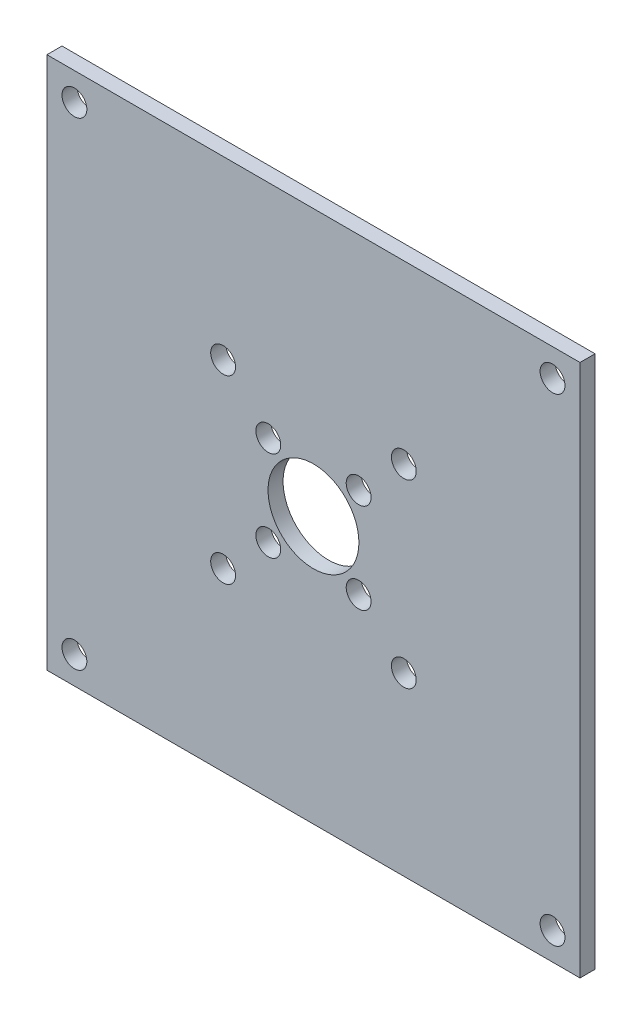
ISO-10303-21;
HEADER;
FILE_DESCRIPTION(('STEP AP214'),'2;1');
FILE_NAME('part.step','',(''),(''),'','','');
FILE_SCHEMA(('AUTOMOTIVE_DESIGN { 1 0 10303 214 1 1 1 1 }'));
ENDSEC;
DATA;
#1=APPLICATION_CONTEXT('core data for automotive mechanical design processes');
#2=APPLICATION_PROTOCOL_DEFINITION('international standard','automotive_design',2000,#1);
#3=PRODUCT_CONTEXT('',#1,'mechanical');
#4=PRODUCT('Part','Part','',(#3));
#5=PRODUCT_RELATED_PRODUCT_CATEGORY('part','',(#4));
#6=PRODUCT_DEFINITION_FORMATION('','',#4);
#7=PRODUCT_DEFINITION_CONTEXT('part definition',#1,'design');
#8=PRODUCT_DEFINITION('design','',#6,#7);
#9=PRODUCT_DEFINITION_SHAPE('','',#8);
#10=(LENGTH_UNIT() NAMED_UNIT(*) SI_UNIT(.MILLI.,.METRE.));
#11=(NAMED_UNIT(*) PLANE_ANGLE_UNIT() SI_UNIT($,.RADIAN.));
#12=(NAMED_UNIT(*) SI_UNIT($,.STERADIAN.) SOLID_ANGLE_UNIT());
#13=UNCERTAINTY_MEASURE_WITH_UNIT(LENGTH_MEASURE(1.E-05),#10,'distance_accuracy_value','');
#14=(GEOMETRIC_REPRESENTATION_CONTEXT(3) GLOBAL_UNCERTAINTY_ASSIGNED_CONTEXT((#13)) GLOBAL_UNIT_ASSIGNED_CONTEXT((#10,
#11,#12)) REPRESENTATION_CONTEXT('',''));
#15=CARTESIAN_POINT('',(0.,0.,0.));
#16=DIRECTION('',(0.,0.,1.));
#17=DIRECTION('',(1.,0.,0.));
#18=AXIS2_PLACEMENT_3D('',#15,#16,#17);
#19=CARTESIAN_POINT('',(0.,0.,5.));
#20=DIRECTION('',(0.,1.,0.));
#21=DIRECTION('',(0.,0.,1.));
#22=AXIS2_PLACEMENT_3D('',#19,#20,#21);
#23=PLANE('',#22);
#24=DIRECTION('',(1.,0.,0.));
#25=VECTOR('',#24,1.);
#26=CARTESIAN_POINT('',(0.,0.,0.));
#27=LINE('',#26,#25);
#28=CARTESIAN_POINT('',(0.,0.,0.));
#29=VERTEX_POINT('',#28);
#30=CARTESIAN_POINT('',(177.,0.,0.));
#31=VERTEX_POINT('',#30);
#32=EDGE_CURVE('E139',#29,#31,#27,.T.);
#33=ORIENTED_EDGE('',*,*,#32,.T.);
#34=DIRECTION('',(0.,0.,-1.));
#35=VECTOR('',#34,1.);
#36=CARTESIAN_POINT('',(177.,0.,5.));
#37=LINE('',#36,#35);
#38=CARTESIAN_POINT('',(177.,0.,5.));
#39=VERTEX_POINT('',#38);
#40=EDGE_CURVE('E11',#39,#31,#37,.T.);
#41=ORIENTED_EDGE('',*,*,#40,.F.);
#42=DIRECTION('',(1.,0.,0.));
#43=VECTOR('',#42,1.);
#44=CARTESIAN_POINT('',(0.,0.,5.));
#45=LINE('',#44,#43);
#46=CARTESIAN_POINT('',(0.,0.,5.));
#47=VERTEX_POINT('',#46);
#48=EDGE_CURVE('E86',#47,#39,#45,.T.);
#49=ORIENTED_EDGE('',*,*,#48,.F.);
#50=DIRECTION('',(0.,0.,-1.));
#51=VECTOR('',#50,1.);
#52=CARTESIAN_POINT('',(0.,0.,5.));
#53=LINE('',#52,#51);
#54=EDGE_CURVE('E52',#47,#29,#53,.T.);
#55=ORIENTED_EDGE('',*,*,#54,.T.);
#56=EDGE_LOOP('',(#33,#41,#49,#55));
#57=FACE_BOUND('',#56,.T.);
#58=ADVANCED_FACE('F35',(#57),#23,.F.);
#59=CARTESIAN_POINT('',(177.,0.,5.));
#60=DIRECTION('',(-1.,0.,0.));
#61=DIRECTION('',(0.,-1.,0.));
#62=AXIS2_PLACEMENT_3D('',#59,#60,#61);
#63=PLANE('',#62);
#64=DIRECTION('',(0.,1.,0.));
#65=VECTOR('',#64,1.);
#66=CARTESIAN_POINT('',(177.,0.,0.));
#67=LINE('',#66,#65);
#68=CARTESIAN_POINT('',(177.,177.,0.));
#69=VERTEX_POINT('',#68);
#70=EDGE_CURVE('E91',#31,#69,#67,.T.);
#71=ORIENTED_EDGE('',*,*,#70,.T.);
#72=DIRECTION('',(0.,0.,-1.));
#73=VECTOR('',#72,1.);
#74=CARTESIAN_POINT('',(177.,177.,5.));
#75=LINE('',#74,#73);
#76=CARTESIAN_POINT('',(177.,177.,5.));
#77=VERTEX_POINT('',#76);
#78=EDGE_CURVE('E44',#77,#69,#75,.T.);
#79=ORIENTED_EDGE('',*,*,#78,.F.);
#80=DIRECTION('',(0.,1.,0.));
#81=VECTOR('',#80,1.);
#82=CARTESIAN_POINT('',(177.,0.,5.));
#83=LINE('',#82,#81);
#84=EDGE_CURVE('E77',#39,#77,#83,.T.);
#85=ORIENTED_EDGE('',*,*,#84,.F.);
#86=ORIENTED_EDGE('',*,*,#40,.T.);
#87=EDGE_LOOP('',(#71,#79,#85,#86));
#88=FACE_BOUND('',#87,.T.);
#89=ADVANCED_FACE('F90',(#88),#63,.F.);
#90=CARTESIAN_POINT('',(0.,177.,5.));
#91=DIRECTION('',(0.,1.,0.));
#92=DIRECTION('',(0.,0.,1.));
#93=AXIS2_PLACEMENT_3D('',#90,#91,#92);
#94=PLANE('',#93);
#95=DIRECTION('',(1.,0.,0.));
#96=VECTOR('',#95,1.);
#97=CARTESIAN_POINT('',(0.,177.,0.));
#98=LINE('',#97,#96);
#99=CARTESIAN_POINT('',(0.,177.,0.));
#100=VERTEX_POINT('',#99);
#101=EDGE_CURVE('E142',#100,#69,#98,.T.);
#102=ORIENTED_EDGE('',*,*,#101,.F.);
#103=DIRECTION('',(0.,0.,-1.));
#104=VECTOR('',#103,1.);
#105=CARTESIAN_POINT('',(0.,177.,5.));
#106=LINE('',#105,#104);
#107=CARTESIAN_POINT('',(0.,177.,5.));
#108=VERTEX_POINT('',#107);
#109=EDGE_CURVE('E66',#108,#100,#106,.T.);
#110=ORIENTED_EDGE('',*,*,#109,.F.);
#111=DIRECTION('',(1.,0.,0.));
#112=VECTOR('',#111,1.);
#113=CARTESIAN_POINT('',(0.,177.,5.));
#114=LINE('',#113,#112);
#115=EDGE_CURVE('E85',#108,#77,#114,.T.);
#116=ORIENTED_EDGE('',*,*,#115,.T.);
#117=ORIENTED_EDGE('',*,*,#78,.T.);
#118=EDGE_LOOP('',(#102,#110,#116,#117));
#119=FACE_BOUND('',#118,.T.);
#120=ADVANCED_FACE('F94',(#119),#94,.T.);
#121=CARTESIAN_POINT('',(9.125,9.12500000000001,5.));
#122=DIRECTION('',(0.,0.,-1.));
#123=DIRECTION('',(-1.,0.,0.));
#124=AXIS2_PLACEMENT_3D('',#121,#122,#123);
#125=CYLINDRICAL_SURFACE('',#124,4.125);
#126=CARTESIAN_POINT('',(9.125,9.12500000000001,5.));
#127=DIRECTION('',(0.,0.,1.));
#128=DIRECTION('',(1.,0.,0.));
#129=AXIS2_PLACEMENT_3D('',#126,#127,#128);
#130=CIRCLE('',#129,4.125);
#131=CARTESIAN_POINT('',(13.25,9.12500000000001,5.));
#132=VERTEX_POINT('',#131);
#133=EDGE_CURVE('E112',#132,#132,#130,.T.);
#134=ORIENTED_EDGE('',*,*,#133,.T.);
#135=EDGE_LOOP('',(#134));
#136=FACE_BOUND('',#135,.T.);
#137=CARTESIAN_POINT('',(9.125,9.12500000000001,0.));
#138=DIRECTION('',(0.,0.,1.));
#139=DIRECTION('',(1.,0.,0.));
#140=AXIS2_PLACEMENT_3D('',#137,#138,#139);
#141=CIRCLE('',#140,4.125);
#142=CARTESIAN_POINT('',(13.25,9.12500000000001,0.));
#143=VERTEX_POINT('',#142);
#144=EDGE_CURVE('E159',#143,#143,#141,.T.);
#145=ORIENTED_EDGE('',*,*,#144,.F.);
#146=EDGE_LOOP('',(#145));
#147=FACE_BOUND('',#146,.T.);
#148=ADVANCED_FACE('F269',(#136,#147),#125,.F.);
#149=CARTESIAN_POINT('',(167.875,167.875,5.));
#150=DIRECTION('',(0.,0.,-1.));
#151=DIRECTION('',(-1.,0.,0.));
#152=AXIS2_PLACEMENT_3D('',#149,#150,#151);
#153=CYLINDRICAL_SURFACE('',#152,4.125);
#154=CARTESIAN_POINT('',(167.875,167.875,5.));
#155=DIRECTION('',(0.,0.,1.));
#156=DIRECTION('',(1.,0.,0.));
#157=AXIS2_PLACEMENT_3D('',#154,#155,#156);
#158=CIRCLE('',#157,4.125);
#159=CARTESIAN_POINT('',(172.,167.875,5.));
#160=VERTEX_POINT('',#159);
#161=EDGE_CURVE('E109',#160,#160,#158,.T.);
#162=ORIENTED_EDGE('',*,*,#161,.T.);
#163=EDGE_LOOP('',(#162));
#164=FACE_BOUND('',#163,.T.);
#165=CARTESIAN_POINT('',(167.875,167.875,0.));
#166=DIRECTION('',(0.,0.,1.));
#167=DIRECTION('',(1.,0.,0.));
#168=AXIS2_PLACEMENT_3D('',#165,#166,#167);
#169=CIRCLE('',#168,4.125);
#170=CARTESIAN_POINT('',(172.,167.875,0.));
#171=VERTEX_POINT('',#170);
#172=EDGE_CURVE('E156',#171,#171,#169,.T.);
#173=ORIENTED_EDGE('',*,*,#172,.F.);
#174=EDGE_LOOP('',(#173));
#175=FACE_BOUND('',#174,.T.);
#176=ADVANCED_FACE('F271',(#164,#175),#153,.F.);
#177=CARTESIAN_POINT('',(9.12499999999999,167.875,5.));
#178=DIRECTION('',(0.,0.,-1.));
#179=DIRECTION('',(-1.,0.,0.));
#180=AXIS2_PLACEMENT_3D('',#177,#178,#179);
#181=CYLINDRICAL_SURFACE('',#180,4.125);
#182=CARTESIAN_POINT('',(9.12499999999999,167.875,5.));
#183=DIRECTION('',(0.,0.,1.));
#184=DIRECTION('',(1.,0.,0.));
#185=AXIS2_PLACEMENT_3D('',#182,#183,#184);
#186=CIRCLE('',#185,4.125);
#187=CARTESIAN_POINT('',(13.25,167.875,5.));
#188=VERTEX_POINT('',#187);
#189=EDGE_CURVE('E106',#188,#188,#186,.F.);
#190=ORIENTED_EDGE('',*,*,#189,.F.);
#191=EDGE_LOOP('',(#190));
#192=FACE_BOUND('',#191,.T.);
#193=CARTESIAN_POINT('',(9.12499999999999,167.875,0.));
#194=DIRECTION('',(0.,0.,1.));
#195=DIRECTION('',(1.,0.,0.));
#196=AXIS2_PLACEMENT_3D('',#193,#194,#195);
#197=CIRCLE('',#196,4.125);
#198=CARTESIAN_POINT('',(13.25,167.875,0.));
#199=VERTEX_POINT('',#198);
#200=EDGE_CURVE('E153',#199,#199,#197,.F.);
#201=ORIENTED_EDGE('',*,*,#200,.T.);
#202=EDGE_LOOP('',(#201));
#203=FACE_BOUND('',#202,.T.);
#204=ADVANCED_FACE('F278',(#192,#203),#181,.F.);
#205=CARTESIAN_POINT('',(58.4999999999999,118.5,5.));
#206=DIRECTION('',(0.,0.,-1.));
#207=DIRECTION('',(-1.,0.,0.));
#208=AXIS2_PLACEMENT_3D('',#205,#206,#207);
#209=CYLINDRICAL_SURFACE('',#208,4.12499999999997);
#210=CARTESIAN_POINT('',(58.4999999999999,118.5,5.));
#211=DIRECTION('',(0.,0.,1.));
#212=DIRECTION('',(1.,0.,0.));
#213=AXIS2_PLACEMENT_3D('',#210,#211,#212);
#214=CIRCLE('',#213,4.12499999999997);
#215=CARTESIAN_POINT('',(62.6249999999999,118.5,5.));
#216=VERTEX_POINT('',#215);
#217=EDGE_CURVE('E103',#216,#216,#214,.F.);
#218=ORIENTED_EDGE('',*,*,#217,.F.);
#219=EDGE_LOOP('',(#218));
#220=FACE_BOUND('',#219,.T.);
#221=CARTESIAN_POINT('',(58.4999999999999,118.5,0.));
#222=DIRECTION('',(0.,0.,1.));
#223=DIRECTION('',(1.,0.,0.));
#224=AXIS2_PLACEMENT_3D('',#221,#222,#223);
#225=CIRCLE('',#224,4.12499999999997);
#226=CARTESIAN_POINT('',(62.6249999999999,118.5,0.));
#227=VERTEX_POINT('',#226);
#228=EDGE_CURVE('E150',#227,#227,#225,.F.);
#229=ORIENTED_EDGE('',*,*,#228,.T.);
#230=EDGE_LOOP('',(#229));
#231=FACE_BOUND('',#230,.T.);
#232=ADVANCED_FACE('F284',(#220,#231),#209,.F.);
#233=CARTESIAN_POINT('',(73.5,103.5,5.));
#234=DIRECTION('',(0.,0.,-1.));
#235=DIRECTION('',(-1.,0.,0.));
#236=AXIS2_PLACEMENT_3D('',#233,#234,#235);
#237=CYLINDRICAL_SURFACE('',#236,4.125);
#238=CARTESIAN_POINT('',(73.5,103.5,5.));
#239=DIRECTION('',(0.,0.,1.));
#240=DIRECTION('',(1.,0.,0.));
#241=AXIS2_PLACEMENT_3D('',#238,#239,#240);
#242=CIRCLE('',#241,4.125);
#243=CARTESIAN_POINT('',(77.625,103.5,5.));
#244=VERTEX_POINT('',#243);
#245=EDGE_CURVE('E97',#244,#244,#242,.F.);
#246=ORIENTED_EDGE('',*,*,#245,.F.);
#247=EDGE_LOOP('',(#246));
#248=FACE_BOUND('',#247,.T.);
#249=CARTESIAN_POINT('',(73.5,103.5,0.));
#250=DIRECTION('',(0.,0.,1.));
#251=DIRECTION('',(1.,0.,0.));
#252=AXIS2_PLACEMENT_3D('',#249,#250,#251);
#253=CIRCLE('',#252,4.125);
#254=CARTESIAN_POINT('',(77.625,103.5,0.));
#255=VERTEX_POINT('',#254);
#256=EDGE_CURVE('E147',#255,#255,#253,.F.);
#257=ORIENTED_EDGE('',*,*,#256,.T.);
#258=EDGE_LOOP('',(#257));
#259=FACE_BOUND('',#258,.T.);
#260=ADVANCED_FACE('F288',(#248,#259),#237,.F.);
#261=CARTESIAN_POINT('',(0.,0.,5.));
#262=DIRECTION('',(-1.,0.,0.));
#263=DIRECTION('',(0.,-1.,0.));
#264=AXIS2_PLACEMENT_3D('',#261,#262,#263);
#265=PLANE('',#264);
#266=DIRECTION('',(0.,1.,0.));
#267=VECTOR('',#266,1.);
#268=CARTESIAN_POINT('',(0.,0.,0.));
#269=LINE('',#268,#267);
#270=EDGE_CURVE('E144',#29,#100,#269,.T.);
#271=ORIENTED_EDGE('',*,*,#270,.F.);
#272=ORIENTED_EDGE('',*,*,#54,.F.);
#273=DIRECTION('',(0.,1.,0.));
#274=VECTOR('',#273,1.);
#275=CARTESIAN_POINT('',(0.,0.,5.));
#276=LINE('',#275,#274);
#277=EDGE_CURVE('E95',#47,#108,#276,.T.);
#278=ORIENTED_EDGE('',*,*,#277,.T.);
#279=ORIENTED_EDGE('',*,*,#109,.T.);
#280=EDGE_LOOP('',(#271,#272,#278,#279));
#281=FACE_BOUND('',#280,.T.);
#282=ADVANCED_FACE('F221',(#281),#265,.T.);
#283=CARTESIAN_POINT('',(88.5,88.5,5.));
#284=DIRECTION('',(0.,0.,-1.));
#285=DIRECTION('',(-1.,0.,0.));
#286=AXIS2_PLACEMENT_3D('',#283,#284,#285);
#287=CYLINDRICAL_SURFACE('',#286,15.0882034355964);
#288=CARTESIAN_POINT('',(88.5,88.5,5.));
#289=DIRECTION('',(0.,0.,1.));
#290=DIRECTION('',(1.,0.,0.));
#291=AXIS2_PLACEMENT_3D('',#288,#289,#290);
#292=CIRCLE('',#291,15.0882034355964);
#293=CARTESIAN_POINT('',(103.588203435596,88.5,5.));
#294=VERTEX_POINT('',#293);
#295=EDGE_CURVE('E189',#294,#294,#292,.T.);
#296=ORIENTED_EDGE('',*,*,#295,.T.);
#297=EDGE_LOOP('',(#296));
#298=FACE_BOUND('',#297,.T.);
#299=CARTESIAN_POINT('',(88.5,88.5,0.));
#300=DIRECTION('',(0.,0.,1.));
#301=DIRECTION('',(1.,0.,0.));
#302=AXIS2_PLACEMENT_3D('',#299,#300,#301);
#303=CIRCLE('',#302,15.0882034355964);
#304=CARTESIAN_POINT('',(103.588203435596,88.5,0.));
#305=VERTEX_POINT('',#304);
#306=EDGE_CURVE('E136',#305,#305,#303,.T.);
#307=ORIENTED_EDGE('',*,*,#306,.F.);
#308=EDGE_LOOP('',(#307));
#309=FACE_BOUND('',#308,.T.);
#310=ADVANCED_FACE('F193',(#298,#309),#287,.F.);
#311=CARTESIAN_POINT('',(73.5,73.5,5.));
#312=DIRECTION('',(0.,0.,-1.));
#313=DIRECTION('',(-1.,0.,0.));
#314=AXIS2_PLACEMENT_3D('',#311,#312,#313);
#315=CYLINDRICAL_SURFACE('',#314,4.125);
#316=CARTESIAN_POINT('',(73.5,73.5,5.));
#317=DIRECTION('',(0.,0.,1.));
#318=DIRECTION('',(1.,0.,0.));
#319=AXIS2_PLACEMENT_3D('',#316,#317,#318);
#320=CIRCLE('',#319,4.125);
#321=CARTESIAN_POINT('',(77.625,73.5,5.));
#322=VERTEX_POINT('',#321);
#323=EDGE_CURVE('E186',#322,#322,#320,.T.);
#324=ORIENTED_EDGE('',*,*,#323,.T.);
#325=EDGE_LOOP('',(#324));
#326=FACE_BOUND('',#325,.T.);
#327=CARTESIAN_POINT('',(73.5,73.5,0.));
#328=DIRECTION('',(0.,0.,1.));
#329=DIRECTION('',(1.,0.,0.));
#330=AXIS2_PLACEMENT_3D('',#327,#328,#329);
#331=CIRCLE('',#330,4.125);
#332=CARTESIAN_POINT('',(77.625,73.5,0.));
#333=VERTEX_POINT('',#332);
#334=EDGE_CURVE('E133',#333,#333,#331,.T.);
#335=ORIENTED_EDGE('',*,*,#334,.F.);
#336=EDGE_LOOP('',(#335));
#337=FACE_BOUND('',#336,.T.);
#338=ADVANCED_FACE('F220',(#326,#337),#315,.F.);
#339=CARTESIAN_POINT('',(103.5,73.5,5.));
#340=DIRECTION('',(0.,0.,-1.));
#341=DIRECTION('',(-1.,0.,0.));
#342=AXIS2_PLACEMENT_3D('',#339,#340,#341);
#343=CYLINDRICAL_SURFACE('',#342,4.12499999999999);
#344=CARTESIAN_POINT('',(103.5,73.5,5.));
#345=DIRECTION('',(0.,0.,1.));
#346=DIRECTION('',(1.,0.,0.));
#347=AXIS2_PLACEMENT_3D('',#344,#345,#346);
#348=CIRCLE('',#347,4.12499999999999);
#349=CARTESIAN_POINT('',(107.625,73.5,5.));
#350=VERTEX_POINT('',#349);
#351=EDGE_CURVE('E183',#350,#350,#348,.F.);
#352=ORIENTED_EDGE('',*,*,#351,.F.);
#353=EDGE_LOOP('',(#352));
#354=FACE_BOUND('',#353,.T.);
#355=CARTESIAN_POINT('',(103.5,73.5,0.));
#356=DIRECTION('',(0.,0.,1.));
#357=DIRECTION('',(1.,0.,0.));
#358=AXIS2_PLACEMENT_3D('',#355,#356,#357);
#359=CIRCLE('',#358,4.12499999999999);
#360=CARTESIAN_POINT('',(107.625,73.5,0.));
#361=VERTEX_POINT('',#360);
#362=EDGE_CURVE('E130',#361,#361,#359,.F.);
#363=ORIENTED_EDGE('',*,*,#362,.T.);
#364=EDGE_LOOP('',(#363));
#365=FACE_BOUND('',#364,.T.);
#366=ADVANCED_FACE('F224',(#354,#365),#343,.F.);
#367=CARTESIAN_POINT('',(103.5,103.5,5.));
#368=DIRECTION('',(0.,0.,-1.));
#369=DIRECTION('',(-1.,0.,0.));
#370=AXIS2_PLACEMENT_3D('',#367,#368,#369);
#371=CYLINDRICAL_SURFACE('',#370,4.12499999999999);
#372=CARTESIAN_POINT('',(103.5,103.5,5.));
#373=DIRECTION('',(0.,0.,1.));
#374=DIRECTION('',(1.,0.,0.));
#375=AXIS2_PLACEMENT_3D('',#372,#373,#374);
#376=CIRCLE('',#375,4.12499999999999);
#377=CARTESIAN_POINT('',(107.625,103.5,5.));
#378=VERTEX_POINT('',#377);
#379=EDGE_CURVE('E180',#378,#378,#376,.T.);
#380=ORIENTED_EDGE('',*,*,#379,.T.);
#381=EDGE_LOOP('',(#380));
#382=FACE_BOUND('',#381,.T.);
#383=CARTESIAN_POINT('',(103.5,103.5,0.));
#384=DIRECTION('',(0.,0.,1.));
#385=DIRECTION('',(1.,0.,0.));
#386=AXIS2_PLACEMENT_3D('',#383,#384,#385);
#387=CIRCLE('',#386,4.12499999999999);
#388=CARTESIAN_POINT('',(107.625,103.5,0.));
#389=VERTEX_POINT('',#388);
#390=EDGE_CURVE('E127',#389,#389,#387,.T.);
#391=ORIENTED_EDGE('',*,*,#390,.F.);
#392=EDGE_LOOP('',(#391));
#393=FACE_BOUND('',#392,.T.);
#394=ADVANCED_FACE('F228',(#382,#393),#371,.F.);
#395=CARTESIAN_POINT('',(58.4999999999998,58.5,5.));
#396=DIRECTION('',(0.,0.,-1.));
#397=DIRECTION('',(-1.,0.,0.));
#398=AXIS2_PLACEMENT_3D('',#395,#396,#397);
#399=CYLINDRICAL_SURFACE('',#398,4.12500000000001);
#400=CARTESIAN_POINT('',(58.4999999999998,58.5,5.));
#401=DIRECTION('',(0.,0.,1.));
#402=DIRECTION('',(1.,0.,0.));
#403=AXIS2_PLACEMENT_3D('',#400,#401,#402);
#404=CIRCLE('',#403,4.12500000000001);
#405=CARTESIAN_POINT('',(62.6249999999998,58.5,5.));
#406=VERTEX_POINT('',#405);
#407=EDGE_CURVE('E175',#406,#406,#404,.T.);
#408=ORIENTED_EDGE('',*,*,#407,.T.);
#409=EDGE_LOOP('',(#408));
#410=FACE_BOUND('',#409,.T.);
#411=CARTESIAN_POINT('',(58.4999999999998,58.5,0.));
#412=DIRECTION('',(0.,0.,1.));
#413=DIRECTION('',(1.,0.,0.));
#414=AXIS2_PLACEMENT_3D('',#411,#412,#413);
#415=CIRCLE('',#414,4.12500000000001);
#416=CARTESIAN_POINT('',(62.6249999999998,58.5,0.));
#417=VERTEX_POINT('',#416);
#418=EDGE_CURVE('E124',#417,#417,#415,.T.);
#419=ORIENTED_EDGE('',*,*,#418,.F.);
#420=EDGE_LOOP('',(#419));
#421=FACE_BOUND('',#420,.T.);
#422=ADVANCED_FACE('F232',(#410,#421),#399,.F.);
#423=CARTESIAN_POINT('',(118.5,58.5,5.));
#424=DIRECTION('',(0.,0.,-1.));
#425=DIRECTION('',(-1.,0.,0.));
#426=AXIS2_PLACEMENT_3D('',#423,#424,#425);
#427=CYLINDRICAL_SURFACE('',#426,4.1249999999999);
#428=CARTESIAN_POINT('',(118.5,58.5,5.));
#429=DIRECTION('',(0.,0.,1.));
#430=DIRECTION('',(1.,0.,0.));
#431=AXIS2_PLACEMENT_3D('',#428,#429,#430);
#432=CIRCLE('',#431,4.1249999999999);
#433=CARTESIAN_POINT('',(122.625,58.5,5.));
#434=VERTEX_POINT('',#433);
#435=EDGE_CURVE('E170',#434,#434,#432,.F.);
#436=ORIENTED_EDGE('',*,*,#435,.F.);
#437=EDGE_LOOP('',(#436));
#438=FACE_BOUND('',#437,.T.);
#439=CARTESIAN_POINT('',(118.5,58.5,0.));
#440=DIRECTION('',(0.,0.,1.));
#441=DIRECTION('',(1.,0.,0.));
#442=AXIS2_PLACEMENT_3D('',#439,#440,#441);
#443=CIRCLE('',#442,4.1249999999999);
#444=CARTESIAN_POINT('',(122.625,58.5,0.));
#445=VERTEX_POINT('',#444);
#446=EDGE_CURVE('E121',#445,#445,#443,.F.);
#447=ORIENTED_EDGE('',*,*,#446,.T.);
#448=EDGE_LOOP('',(#447));
#449=FACE_BOUND('',#448,.T.);
#450=ADVANCED_FACE('F235',(#438,#449),#427,.F.);
#451=CARTESIAN_POINT('',(118.5,118.5,5.));
#452=DIRECTION('',(0.,0.,-1.));
#453=DIRECTION('',(-1.,0.,0.));
#454=AXIS2_PLACEMENT_3D('',#451,#452,#453);
#455=CYLINDRICAL_SURFACE('',#454,4.12499999999993);
#456=CARTESIAN_POINT('',(118.5,118.5,5.));
#457=DIRECTION('',(0.,0.,1.));
#458=DIRECTION('',(1.,0.,0.));
#459=AXIS2_PLACEMENT_3D('',#456,#457,#458);
#460=CIRCLE('',#459,4.12499999999993);
#461=CARTESIAN_POINT('',(122.625,118.5,5.));
#462=VERTEX_POINT('',#461);
#463=EDGE_CURVE('E165',#462,#462,#460,.T.);
#464=ORIENTED_EDGE('',*,*,#463,.T.);
#465=EDGE_LOOP('',(#464));
#466=FACE_BOUND('',#465,.T.);
#467=CARTESIAN_POINT('',(118.5,118.5,0.));
#468=DIRECTION('',(0.,0.,1.));
#469=DIRECTION('',(1.,0.,0.));
#470=AXIS2_PLACEMENT_3D('',#467,#468,#469);
#471=CIRCLE('',#470,4.12499999999993);
#472=CARTESIAN_POINT('',(122.625,118.5,0.));
#473=VERTEX_POINT('',#472);
#474=EDGE_CURVE('E118',#473,#473,#471,.T.);
#475=ORIENTED_EDGE('',*,*,#474,.F.);
#476=EDGE_LOOP('',(#475));
#477=FACE_BOUND('',#476,.T.);
#478=ADVANCED_FACE('F37',(#466,#477),#455,.F.);
#479=CARTESIAN_POINT('',(167.875,9.12500000000001,5.));
#480=DIRECTION('',(0.,0.,-1.));
#481=DIRECTION('',(-1.,0.,0.));
#482=AXIS2_PLACEMENT_3D('',#479,#480,#481);
#483=CYLINDRICAL_SURFACE('',#482,4.125);
#484=CARTESIAN_POINT('',(167.875,9.12500000000001,5.));
#485=DIRECTION('',(0.,0.,1.));
#486=DIRECTION('',(1.,0.,0.));
#487=AXIS2_PLACEMENT_3D('',#484,#485,#486);
#488=CIRCLE('',#487,4.125);
#489=CARTESIAN_POINT('',(172.,9.12500000000001,5.));
#490=VERTEX_POINT('',#489);
#491=EDGE_CURVE('E115',#490,#490,#488,.F.);
#492=ORIENTED_EDGE('',*,*,#491,.F.);
#493=EDGE_LOOP('',(#492));
#494=FACE_BOUND('',#493,.T.);
#495=CARTESIAN_POINT('',(167.875,9.12500000000001,0.));
#496=DIRECTION('',(0.,0.,1.));
#497=DIRECTION('',(1.,0.,0.));
#498=AXIS2_PLACEMENT_3D('',#495,#496,#497);
#499=CIRCLE('',#498,4.125);
#500=CARTESIAN_POINT('',(172.,9.12500000000001,0.));
#501=VERTEX_POINT('',#500);
#502=EDGE_CURVE('E162',#501,#501,#499,.F.);
#503=ORIENTED_EDGE('',*,*,#502,.T.);
#504=EDGE_LOOP('',(#503));
#505=FACE_BOUND('',#504,.T.);
#506=ADVANCED_FACE('F198',(#494,#505),#483,.F.);
#507=CARTESIAN_POINT('',(0.,0.,5.));
#508=DIRECTION('',(0.,0.,1.));
#509=DIRECTION('',(1.,0.,0.));
#510=AXIS2_PLACEMENT_3D('',#507,#508,#509);
#511=PLANE('',#510);
#512=ORIENTED_EDGE('',*,*,#463,.F.);
#513=EDGE_LOOP('',(#512));
#514=FACE_BOUND('',#513,.T.);
#515=ORIENTED_EDGE('',*,*,#435,.T.);
#516=EDGE_LOOP('',(#515));
#517=FACE_BOUND('',#516,.T.);
#518=ORIENTED_EDGE('',*,*,#407,.F.);
#519=EDGE_LOOP('',(#518));
#520=FACE_BOUND('',#519,.T.);
#521=ORIENTED_EDGE('',*,*,#379,.F.);
#522=EDGE_LOOP('',(#521));
#523=FACE_BOUND('',#522,.T.);
#524=ORIENTED_EDGE('',*,*,#351,.T.);
#525=EDGE_LOOP('',(#524));
#526=FACE_BOUND('',#525,.T.);
#527=ORIENTED_EDGE('',*,*,#323,.F.);
#528=EDGE_LOOP('',(#527));
#529=FACE_BOUND('',#528,.T.);
#530=ORIENTED_EDGE('',*,*,#295,.F.);
#531=EDGE_LOOP('',(#530));
#532=FACE_BOUND('',#531,.T.);
#533=ORIENTED_EDGE('',*,*,#48,.T.);
#534=ORIENTED_EDGE('',*,*,#84,.T.);
#535=ORIENTED_EDGE('',*,*,#115,.F.);
#536=ORIENTED_EDGE('',*,*,#277,.F.);
#537=EDGE_LOOP('',(#533,#534,#535,#536));
#538=FACE_BOUND('',#537,.T.);
#539=ORIENTED_EDGE('',*,*,#245,.T.);
#540=EDGE_LOOP('',(#539));
#541=FACE_BOUND('',#540,.T.);
#542=ORIENTED_EDGE('',*,*,#217,.T.);
#543=EDGE_LOOP('',(#542));
#544=FACE_BOUND('',#543,.T.);
#545=ORIENTED_EDGE('',*,*,#189,.T.);
#546=EDGE_LOOP('',(#545));
#547=FACE_BOUND('',#546,.T.);
#548=ORIENTED_EDGE('',*,*,#161,.F.);
#549=EDGE_LOOP('',(#548));
#550=FACE_BOUND('',#549,.T.);
#551=ORIENTED_EDGE('',*,*,#133,.F.);
#552=EDGE_LOOP('',(#551));
#553=FACE_BOUND('',#552,.T.);
#554=ORIENTED_EDGE('',*,*,#491,.T.);
#555=EDGE_LOOP('',(#554));
#556=FACE_BOUND('',#555,.T.);
#557=ADVANCED_FACE('F81',(#514,#517,#520,#523,#526,#529,#532,#538,#541,#544,#547,#550,#553,
#556),#511,.T.);
#558=CARTESIAN_POINT('',(0.,0.,0.));
#559=DIRECTION('',(0.,0.,1.));
#560=DIRECTION('',(1.,0.,0.));
#561=AXIS2_PLACEMENT_3D('',#558,#559,#560);
#562=PLANE('',#561);
#563=ORIENTED_EDGE('',*,*,#474,.T.);
#564=EDGE_LOOP('',(#563));
#565=FACE_BOUND('',#564,.T.);
#566=ORIENTED_EDGE('',*,*,#446,.F.);
#567=EDGE_LOOP('',(#566));
#568=FACE_BOUND('',#567,.T.);
#569=ORIENTED_EDGE('',*,*,#418,.T.);
#570=EDGE_LOOP('',(#569));
#571=FACE_BOUND('',#570,.T.);
#572=ORIENTED_EDGE('',*,*,#390,.T.);
#573=EDGE_LOOP('',(#572));
#574=FACE_BOUND('',#573,.T.);
#575=ORIENTED_EDGE('',*,*,#362,.F.);
#576=EDGE_LOOP('',(#575));
#577=FACE_BOUND('',#576,.T.);
#578=ORIENTED_EDGE('',*,*,#334,.T.);
#579=EDGE_LOOP('',(#578));
#580=FACE_BOUND('',#579,.T.);
#581=ORIENTED_EDGE('',*,*,#306,.T.);
#582=EDGE_LOOP('',(#581));
#583=FACE_BOUND('',#582,.T.);
#584=ORIENTED_EDGE('',*,*,#32,.F.);
#585=ORIENTED_EDGE('',*,*,#270,.T.);
#586=ORIENTED_EDGE('',*,*,#101,.T.);
#587=ORIENTED_EDGE('',*,*,#70,.F.);
#588=EDGE_LOOP('',(#584,#585,#586,#587));
#589=FACE_BOUND('',#588,.T.);
#590=ORIENTED_EDGE('',*,*,#256,.F.);
#591=EDGE_LOOP('',(#590));
#592=FACE_BOUND('',#591,.T.);
#593=ORIENTED_EDGE('',*,*,#228,.F.);
#594=EDGE_LOOP('',(#593));
#595=FACE_BOUND('',#594,.T.);
#596=ORIENTED_EDGE('',*,*,#200,.F.);
#597=EDGE_LOOP('',(#596));
#598=FACE_BOUND('',#597,.T.);
#599=ORIENTED_EDGE('',*,*,#172,.T.);
#600=EDGE_LOOP('',(#599));
#601=FACE_BOUND('',#600,.T.);
#602=ORIENTED_EDGE('',*,*,#144,.T.);
#603=EDGE_LOOP('',(#602));
#604=FACE_BOUND('',#603,.T.);
#605=ORIENTED_EDGE('',*,*,#502,.F.);
#606=EDGE_LOOP('',(#605));
#607=FACE_BOUND('',#606,.T.);
#608=ADVANCED_FACE('F197',(#565,#568,#571,#574,#577,#580,#583,#589,#592,#595,#598,#601,#604,
#607),#562,.F.);
#609=CLOSED_SHELL('',(#58,#89,#120,#148,#176,#204,#232,#260,#282,#310,#338,#366,#394,#422,#450,
#478,#506,#557,#608));
#610=MANIFOLD_SOLID_BREP('B2',#609);
#611=ADVANCED_BREP_SHAPE_REPRESENTATION('',(#18,#610),#14);
#612=SHAPE_DEFINITION_REPRESENTATION(#9,#611);
ENDSEC;
END-ISO-10303-21;
